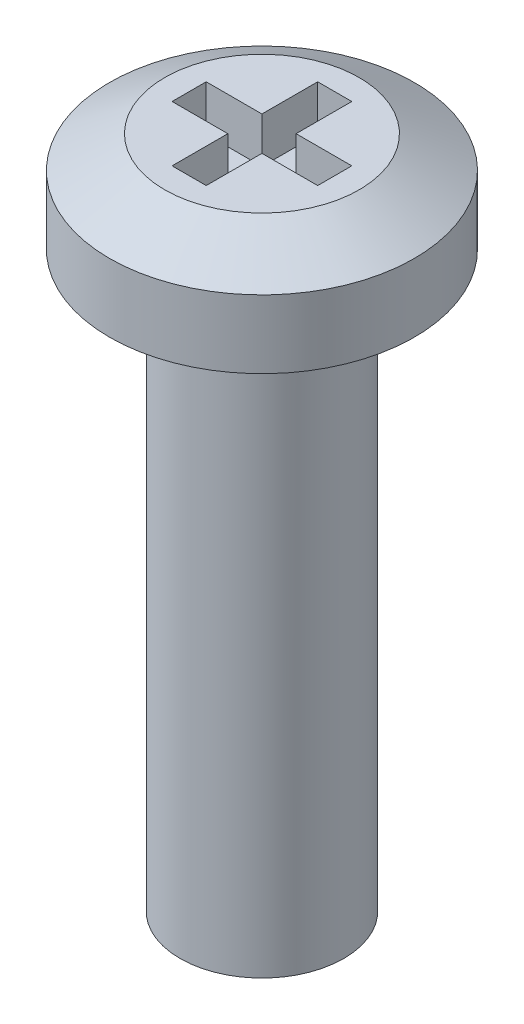
ISO-10303-21;
HEADER;
FILE_DESCRIPTION(('STEP AP214'),'2;1');
FILE_NAME('part.step','',(''),(''),'','','');
FILE_SCHEMA(('AUTOMOTIVE_DESIGN { 1 0 10303 214 1 1 1 1 }'));
ENDSEC;
DATA;
#1=APPLICATION_CONTEXT('core data for automotive mechanical design processes');
#2=APPLICATION_PROTOCOL_DEFINITION('international standard','automotive_design',2000,#1);
#3=PRODUCT_CONTEXT('',#1,'mechanical');
#4=PRODUCT('Part','Part','',(#3));
#5=PRODUCT_RELATED_PRODUCT_CATEGORY('part','',(#4));
#6=PRODUCT_DEFINITION_FORMATION('','',#4);
#7=PRODUCT_DEFINITION_CONTEXT('part definition',#1,'design');
#8=PRODUCT_DEFINITION('design','',#6,#7);
#9=PRODUCT_DEFINITION_SHAPE('','',#8);
#10=(LENGTH_UNIT() NAMED_UNIT(*) SI_UNIT(.MILLI.,.METRE.));
#11=(NAMED_UNIT(*) PLANE_ANGLE_UNIT() SI_UNIT($,.RADIAN.));
#12=(NAMED_UNIT(*) SI_UNIT($,.STERADIAN.) SOLID_ANGLE_UNIT());
#13=UNCERTAINTY_MEASURE_WITH_UNIT(LENGTH_MEASURE(1.E-05),#10,'distance_accuracy_value','');
#14=(GEOMETRIC_REPRESENTATION_CONTEXT(3) GLOBAL_UNCERTAINTY_ASSIGNED_CONTEXT((#13)) GLOBAL_UNIT_ASSIGNED_CONTEXT((#10,
#11,#12)) REPRESENTATION_CONTEXT('',''));
#15=CARTESIAN_POINT('',(0.,0.,0.));
#16=DIRECTION('',(0.,0.,1.));
#17=DIRECTION('',(1.,0.,0.));
#18=AXIS2_PLACEMENT_3D('',#15,#16,#17);
#19=CARTESIAN_POINT('',(0.,2.2,0.));
#20=DIRECTION('',(0.,1.,0.));
#21=DIRECTION('',(0.,0.,1.));
#22=AXIS2_PLACEMENT_3D('',#19,#20,#21);
#23=PLANE('',#22);
#24=CARTESIAN_POINT('',(0.,2.2,0.));
#25=DIRECTION('',(0.,1.,0.));
#26=DIRECTION('',(0.,0.,1.));
#27=AXIS2_PLACEMENT_3D('',#24,#25,#26);
#28=CIRCLE('',#27,2.13756443470178);
#29=CARTESIAN_POINT('',(0.,2.2,2.13756443470178));
#30=VERTEX_POINT('',#29);
#31=EDGE_CURVE('E193',#30,#30,#28,.T.);
#32=ORIENTED_EDGE('',*,*,#31,.T.);
#33=EDGE_LOOP('',(#32));
#34=FACE_BOUND('',#33,.T.);
#35=DIRECTION('',(0.,0.,-1.));
#36=VECTOR('',#35,1.);
#37=CARTESIAN_POINT('',(-1.6,2.2,0.));
#38=LINE('',#37,#36);
#39=CARTESIAN_POINT('',(-1.6,2.2,0.375));
#40=VERTEX_POINT('',#39);
#41=CARTESIAN_POINT('',(-1.6,2.2,-0.375));
#42=VERTEX_POINT('',#41);
#43=EDGE_CURVE('E161',#40,#42,#38,.T.);
#44=ORIENTED_EDGE('',*,*,#43,.T.);
#45=DIRECTION('',(1.,0.,0.));
#46=VECTOR('',#45,1.);
#47=CARTESIAN_POINT('',(0.,2.2,-0.375));
#48=LINE('',#47,#46);
#49=CARTESIAN_POINT('',(-0.375,2.2,-0.375));
#50=VERTEX_POINT('',#49);
#51=EDGE_CURVE('E48',#42,#50,#48,.T.);
#52=ORIENTED_EDGE('',*,*,#51,.T.);
#53=DIRECTION('',(0.,0.,-1.));
#54=VECTOR('',#53,1.);
#55=CARTESIAN_POINT('',(-0.375,2.2,0.));
#56=LINE('',#55,#54);
#57=CARTESIAN_POINT('',(-0.375,2.2,-1.6));
#58=VERTEX_POINT('',#57);
#59=EDGE_CURVE('E98',#50,#58,#56,.T.);
#60=ORIENTED_EDGE('',*,*,#59,.T.);
#61=DIRECTION('',(1.,0.,0.));
#62=VECTOR('',#61,1.);
#63=CARTESIAN_POINT('',(0.,2.2,-1.6));
#64=LINE('',#63,#62);
#65=CARTESIAN_POINT('',(0.375,2.2,-1.6));
#66=VERTEX_POINT('',#65);
#67=EDGE_CURVE('E187',#58,#66,#64,.T.);
#68=ORIENTED_EDGE('',*,*,#67,.T.);
#69=DIRECTION('',(0.,0.,-1.));
#70=VECTOR('',#69,1.);
#71=CARTESIAN_POINT('',(0.375,2.2,0.));
#72=LINE('',#71,#70);
#73=CARTESIAN_POINT('',(0.375,2.2,-0.375));
#74=VERTEX_POINT('',#73);
#75=EDGE_CURVE('E145',#74,#66,#72,.T.);
#76=ORIENTED_EDGE('',*,*,#75,.F.);
#77=DIRECTION('',(1.,0.,0.));
#78=VECTOR('',#77,1.);
#79=CARTESIAN_POINT('',(0.,2.2,-0.375));
#80=LINE('',#79,#78);
#81=CARTESIAN_POINT('',(1.6,2.2,-0.375));
#82=VERTEX_POINT('',#81);
#83=EDGE_CURVE('E183',#74,#82,#80,.T.);
#84=ORIENTED_EDGE('',*,*,#83,.T.);
#85=DIRECTION('',(0.,0.,-1.));
#86=VECTOR('',#85,1.);
#87=CARTESIAN_POINT('',(1.6,2.2,0.));
#88=LINE('',#87,#86);
#89=CARTESIAN_POINT('',(1.6,2.2,0.375));
#90=VERTEX_POINT('',#89);
#91=EDGE_CURVE('E180',#90,#82,#88,.T.);
#92=ORIENTED_EDGE('',*,*,#91,.F.);
#93=DIRECTION('',(1.,0.,0.));
#94=VECTOR('',#93,1.);
#95=CARTESIAN_POINT('',(0.,2.2,0.375));
#96=LINE('',#95,#94);
#97=CARTESIAN_POINT('',(0.375,2.2,0.375));
#98=VERTEX_POINT('',#97);
#99=EDGE_CURVE('E177',#98,#90,#96,.T.);
#100=ORIENTED_EDGE('',*,*,#99,.F.);
#101=DIRECTION('',(0.,0.,-1.));
#102=VECTOR('',#101,1.);
#103=CARTESIAN_POINT('',(0.375,2.2,0.));
#104=LINE('',#103,#102);
#105=CARTESIAN_POINT('',(0.375,2.2,1.6));
#106=VERTEX_POINT('',#105);
#107=EDGE_CURVE('E174',#106,#98,#104,.T.);
#108=ORIENTED_EDGE('',*,*,#107,.F.);
#109=DIRECTION('',(1.,0.,0.));
#110=VECTOR('',#109,1.);
#111=CARTESIAN_POINT('',(0.,2.2,1.6));
#112=LINE('',#111,#110);
#113=CARTESIAN_POINT('',(-0.375,2.2,1.6));
#114=VERTEX_POINT('',#113);
#115=EDGE_CURVE('E171',#114,#106,#112,.T.);
#116=ORIENTED_EDGE('',*,*,#115,.F.);
#117=DIRECTION('',(0.,0.,-1.));
#118=VECTOR('',#117,1.);
#119=CARTESIAN_POINT('',(-0.375,2.2,0.));
#120=LINE('',#119,#118);
#121=CARTESIAN_POINT('',(-0.375,2.2,0.375));
#122=VERTEX_POINT('',#121);
#123=EDGE_CURVE('E168',#114,#122,#120,.T.);
#124=ORIENTED_EDGE('',*,*,#123,.T.);
#125=DIRECTION('',(1.,0.,0.));
#126=VECTOR('',#125,1.);
#127=CARTESIAN_POINT('',(0.,2.2,0.375));
#128=LINE('',#127,#126);
#129=EDGE_CURVE('E165',#40,#122,#128,.T.);
#130=ORIENTED_EDGE('',*,*,#129,.F.);
#131=EDGE_LOOP('',(#44,#52,#60,#68,#76,#84,#92,#100,#108,#116,#124,#130));
#132=FACE_BOUND('',#131,.T.);
#133=ADVANCED_FACE('F33',(#34,#132),#23,.T.);
#134=CARTESIAN_POINT('',(0.,1.5,0.));
#135=DIRECTION('',(0.,-1.,0.));
#136=DIRECTION('',(0.,0.,-1.));
#137=AXIS2_PLACEMENT_3D('',#134,#135,#136);
#138=CYLINDRICAL_SURFACE('',#137,3.35);
#139=CARTESIAN_POINT('',(0.,1.5,0.));
#140=DIRECTION('',(0.,1.,0.));
#141=DIRECTION('',(0.,0.,1.));
#142=AXIS2_PLACEMENT_3D('',#139,#140,#141);
#143=CIRCLE('',#142,3.35);
#144=CARTESIAN_POINT('',(0.,1.5,3.35));
#145=VERTEX_POINT('',#144);
#146=EDGE_CURVE('E41',#145,#145,#143,.T.);
#147=ORIENTED_EDGE('',*,*,#146,.F.);
#148=EDGE_LOOP('',(#147));
#149=FACE_BOUND('',#148,.T.);
#150=CARTESIAN_POINT('',(0.,0.,0.));
#151=DIRECTION('',(0.,1.,0.));
#152=DIRECTION('',(0.,0.,1.));
#153=AXIS2_PLACEMENT_3D('',#150,#151,#152);
#154=CIRCLE('',#153,3.35);
#155=CARTESIAN_POINT('',(0.,0.,3.35));
#156=VERTEX_POINT('',#155);
#157=EDGE_CURVE('E213',#156,#156,#154,.T.);
#158=ORIENTED_EDGE('',*,*,#157,.T.);
#159=EDGE_LOOP('',(#158));
#160=FACE_BOUND('',#159,.T.);
#161=ADVANCED_FACE('F35',(#149,#160),#138,.T.);
#162=CARTESIAN_POINT('',(0.,0.,0.));
#163=DIRECTION('',(0.,1.,0.));
#164=DIRECTION('',(0.,0.,1.));
#165=AXIS2_PLACEMENT_3D('',#162,#163,#164);
#166=PLANE('',#165);
#167=CARTESIAN_POINT('',(0.,0.,0.));
#168=DIRECTION('',(0.,1.,0.));
#169=DIRECTION('',(0.,0.,1.));
#170=AXIS2_PLACEMENT_3D('',#167,#168,#169);
#171=CIRCLE('',#170,1.8);
#172=CARTESIAN_POINT('',(0.,0.,1.8));
#173=VERTEX_POINT('',#172);
#174=EDGE_CURVE('E11',#173,#173,#171,.F.);
#175=ORIENTED_EDGE('',*,*,#174,.F.);
#176=EDGE_LOOP('',(#175));
#177=FACE_BOUND('',#176,.T.);
#178=ORIENTED_EDGE('',*,*,#157,.F.);
#179=EDGE_LOOP('',(#178));
#180=FACE_BOUND('',#179,.T.);
#181=ADVANCED_FACE('F219',(#177,#180),#166,.F.);
#182=CARTESIAN_POINT('',(0.,1.5,0.));
#183=DIRECTION('',(0.,-1.,0.));
#184=DIRECTION('',(0.,0.,1.));
#185=AXIS2_PLACEMENT_3D('',#182,#183,#184);
#186=CONICAL_SURFACE('',#185,3.35,1.0471975511966);
#187=ORIENTED_EDGE('',*,*,#31,.F.);
#188=EDGE_LOOP('',(#187));
#189=FACE_BOUND('',#188,.T.);
#190=ORIENTED_EDGE('',*,*,#146,.T.);
#191=EDGE_LOOP('',(#190));
#192=FACE_BOUND('',#191,.T.);
#193=ADVANCED_FACE('F221',(#189,#192),#186,.T.);
#194=CARTESIAN_POINT('',(0.,1.2,-0.375));
#195=DIRECTION('',(0.,0.,1.));
#196=DIRECTION('',(1.,0.,0.));
#197=AXIS2_PLACEMENT_3D('',#194,#195,#196);
#198=PLANE('',#197);
#199=ORIENTED_EDGE('',*,*,#51,.F.);
#200=DIRECTION('',(0.,1.,0.));
#201=VECTOR('',#200,1.);
#202=CARTESIAN_POINT('',(-1.6,1.2,-0.375));
#203=LINE('',#202,#201);
#204=CARTESIAN_POINT('',(-1.6,1.2,-0.375));
#205=VERTEX_POINT('',#204);
#206=EDGE_CURVE('E159',#205,#42,#203,.T.);
#207=ORIENTED_EDGE('',*,*,#206,.F.);
#208=DIRECTION('',(1.,0.,0.));
#209=VECTOR('',#208,1.);
#210=CARTESIAN_POINT('',(0.,1.2,-0.375));
#211=LINE('',#210,#209);
#212=CARTESIAN_POINT('',(-0.375,1.2,-0.375));
#213=VERTEX_POINT('',#212);
#214=EDGE_CURVE('E190',#205,#213,#211,.T.);
#215=ORIENTED_EDGE('',*,*,#214,.T.);
#216=DIRECTION('',(0.,1.,0.));
#217=VECTOR('',#216,1.);
#218=CARTESIAN_POINT('',(-0.375,1.2,-0.375));
#219=LINE('',#218,#217);
#220=EDGE_CURVE('E191',#213,#50,#219,.T.);
#221=ORIENTED_EDGE('',*,*,#220,.T.);
#222=EDGE_LOOP('',(#199,#207,#215,#221));
#223=FACE_BOUND('',#222,.T.);
#224=ADVANCED_FACE('F227',(#223),#198,.T.);
#225=CARTESIAN_POINT('',(-0.375,1.2,0.));
#226=DIRECTION('',(1.,0.,0.));
#227=DIRECTION('',(0.,0.,-1.));
#228=AXIS2_PLACEMENT_3D('',#225,#226,#227);
#229=PLANE('',#228);
#230=ORIENTED_EDGE('',*,*,#59,.F.);
#231=ORIENTED_EDGE('',*,*,#220,.F.);
#232=DIRECTION('',(0.,0.,-1.));
#233=VECTOR('',#232,1.);
#234=CARTESIAN_POINT('',(-0.375,1.2,0.));
#235=LINE('',#234,#233);
#236=CARTESIAN_POINT('',(-0.375,1.2,-1.6));
#237=VERTEX_POINT('',#236);
#238=EDGE_CURVE('E57',#213,#237,#235,.T.);
#239=ORIENTED_EDGE('',*,*,#238,.T.);
#240=DIRECTION('',(0.,1.,0.));
#241=VECTOR('',#240,1.);
#242=CARTESIAN_POINT('',(-0.375,1.2,-1.6));
#243=LINE('',#242,#241);
#244=EDGE_CURVE('E137',#237,#58,#243,.T.);
#245=ORIENTED_EDGE('',*,*,#244,.T.);
#246=EDGE_LOOP('',(#230,#231,#239,#245));
#247=FACE_BOUND('',#246,.T.);
#248=ADVANCED_FACE('F241',(#247),#229,.T.);
#249=CARTESIAN_POINT('',(0.,1.2,-1.6));
#250=DIRECTION('',(0.,0.,1.));
#251=DIRECTION('',(1.,0.,0.));
#252=AXIS2_PLACEMENT_3D('',#249,#250,#251);
#253=PLANE('',#252);
#254=ORIENTED_EDGE('',*,*,#67,.F.);
#255=ORIENTED_EDGE('',*,*,#244,.F.);
#256=DIRECTION('',(1.,0.,0.));
#257=VECTOR('',#256,1.);
#258=CARTESIAN_POINT('',(0.,1.2,-1.6));
#259=LINE('',#258,#257);
#260=CARTESIAN_POINT('',(0.375,1.2,-1.6));
#261=VERTEX_POINT('',#260);
#262=EDGE_CURVE('E131',#237,#261,#259,.T.);
#263=ORIENTED_EDGE('',*,*,#262,.T.);
#264=DIRECTION('',(0.,1.,0.));
#265=VECTOR('',#264,1.);
#266=CARTESIAN_POINT('',(0.375,1.2,-1.6));
#267=LINE('',#266,#265);
#268=EDGE_CURVE('E135',#261,#66,#267,.T.);
#269=ORIENTED_EDGE('',*,*,#268,.T.);
#270=EDGE_LOOP('',(#254,#255,#263,#269));
#271=FACE_BOUND('',#270,.T.);
#272=ADVANCED_FACE('F134',(#271),#253,.T.);
#273=CARTESIAN_POINT('',(0.375,1.2,0.));
#274=DIRECTION('',(1.,0.,0.));
#275=DIRECTION('',(0.,0.,-1.));
#276=AXIS2_PLACEMENT_3D('',#273,#274,#275);
#277=PLANE('',#276);
#278=ORIENTED_EDGE('',*,*,#75,.T.);
#279=ORIENTED_EDGE('',*,*,#268,.F.);
#280=DIRECTION('',(0.,0.,-1.));
#281=VECTOR('',#280,1.);
#282=CARTESIAN_POINT('',(0.375,1.2,0.));
#283=LINE('',#282,#281);
#284=CARTESIAN_POINT('',(0.375,1.2,-0.375));
#285=VERTEX_POINT('',#284);
#286=EDGE_CURVE('E139',#285,#261,#283,.T.);
#287=ORIENTED_EDGE('',*,*,#286,.F.);
#288=DIRECTION('',(0.,1.,0.));
#289=VECTOR('',#288,1.);
#290=CARTESIAN_POINT('',(0.375,1.2,-0.375));
#291=LINE('',#290,#289);
#292=EDGE_CURVE('E147',#285,#74,#291,.T.);
#293=ORIENTED_EDGE('',*,*,#292,.T.);
#294=EDGE_LOOP('',(#278,#279,#287,#293));
#295=FACE_BOUND('',#294,.T.);
#296=ADVANCED_FACE('F143',(#295),#277,.F.);
#297=CARTESIAN_POINT('',(0.,1.2,-0.375));
#298=DIRECTION('',(0.,0.,1.));
#299=DIRECTION('',(1.,0.,0.));
#300=AXIS2_PLACEMENT_3D('',#297,#298,#299);
#301=PLANE('',#300);
#302=ORIENTED_EDGE('',*,*,#83,.F.);
#303=ORIENTED_EDGE('',*,*,#292,.F.);
#304=DIRECTION('',(1.,0.,0.));
#305=VECTOR('',#304,1.);
#306=CARTESIAN_POINT('',(0.,1.2,-0.375));
#307=LINE('',#306,#305);
#308=CARTESIAN_POINT('',(1.6,1.2,-0.375));
#309=VERTEX_POINT('',#308);
#310=EDGE_CURVE('E152',#285,#309,#307,.T.);
#311=ORIENTED_EDGE('',*,*,#310,.T.);
#312=DIRECTION('',(0.,1.,0.));
#313=VECTOR('',#312,1.);
#314=CARTESIAN_POINT('',(1.6,1.2,-0.375));
#315=LINE('',#314,#313);
#316=EDGE_CURVE('E196',#309,#82,#315,.T.);
#317=ORIENTED_EDGE('',*,*,#316,.T.);
#318=EDGE_LOOP('',(#302,#303,#311,#317));
#319=FACE_BOUND('',#318,.T.);
#320=ADVANCED_FACE('F268',(#319),#301,.T.);
#321=CARTESIAN_POINT('',(1.6,1.2,0.));
#322=DIRECTION('',(1.,0.,0.));
#323=DIRECTION('',(0.,0.,-1.));
#324=AXIS2_PLACEMENT_3D('',#321,#322,#323);
#325=PLANE('',#324);
#326=ORIENTED_EDGE('',*,*,#91,.T.);
#327=ORIENTED_EDGE('',*,*,#316,.F.);
#328=DIRECTION('',(0.,0.,-1.));
#329=VECTOR('',#328,1.);
#330=CARTESIAN_POINT('',(1.6,1.2,0.));
#331=LINE('',#330,#329);
#332=CARTESIAN_POINT('',(1.6,1.2,0.375));
#333=VERTEX_POINT('',#332);
#334=EDGE_CURVE('E154',#333,#309,#331,.T.);
#335=ORIENTED_EDGE('',*,*,#334,.F.);
#336=DIRECTION('',(0.,1.,0.));
#337=VECTOR('',#336,1.);
#338=CARTESIAN_POINT('',(1.6,1.2,0.375));
#339=LINE('',#338,#337);
#340=EDGE_CURVE('E198',#333,#90,#339,.T.);
#341=ORIENTED_EDGE('',*,*,#340,.T.);
#342=EDGE_LOOP('',(#326,#327,#335,#341));
#343=FACE_BOUND('',#342,.T.);
#344=ADVANCED_FACE('F264',(#343),#325,.F.);
#345=CARTESIAN_POINT('',(0.,1.2,0.375));
#346=DIRECTION('',(0.,0.,1.));
#347=DIRECTION('',(1.,0.,0.));
#348=AXIS2_PLACEMENT_3D('',#345,#346,#347);
#349=PLANE('',#348);
#350=ORIENTED_EDGE('',*,*,#99,.T.);
#351=ORIENTED_EDGE('',*,*,#340,.F.);
#352=DIRECTION('',(1.,0.,0.));
#353=VECTOR('',#352,1.);
#354=CARTESIAN_POINT('',(0.,1.2,0.375));
#355=LINE('',#354,#353);
#356=CARTESIAN_POINT('',(0.375,1.2,0.375));
#357=VERTEX_POINT('',#356);
#358=EDGE_CURVE('E307',#357,#333,#355,.T.);
#359=ORIENTED_EDGE('',*,*,#358,.F.);
#360=DIRECTION('',(0.,1.,0.));
#361=VECTOR('',#360,1.);
#362=CARTESIAN_POINT('',(0.375,1.2,0.375));
#363=LINE('',#362,#361);
#364=EDGE_CURVE('E200',#357,#98,#363,.T.);
#365=ORIENTED_EDGE('',*,*,#364,.T.);
#366=EDGE_LOOP('',(#350,#351,#359,#365));
#367=FACE_BOUND('',#366,.T.);
#368=ADVANCED_FACE('F260',(#367),#349,.F.);
#369=CARTESIAN_POINT('',(0.375,1.2,0.));
#370=DIRECTION('',(1.,0.,0.));
#371=DIRECTION('',(0.,0.,-1.));
#372=AXIS2_PLACEMENT_3D('',#369,#370,#371);
#373=PLANE('',#372);
#374=ORIENTED_EDGE('',*,*,#107,.T.);
#375=ORIENTED_EDGE('',*,*,#364,.F.);
#376=DIRECTION('',(0.,0.,-1.));
#377=VECTOR('',#376,1.);
#378=CARTESIAN_POINT('',(0.375,1.2,0.));
#379=LINE('',#378,#377);
#380=CARTESIAN_POINT('',(0.375,1.2,1.6));
#381=VERTEX_POINT('',#380);
#382=EDGE_CURVE('E304',#381,#357,#379,.T.);
#383=ORIENTED_EDGE('',*,*,#382,.F.);
#384=DIRECTION('',(0.,1.,0.));
#385=VECTOR('',#384,1.);
#386=CARTESIAN_POINT('',(0.375,1.2,1.6));
#387=LINE('',#386,#385);
#388=EDGE_CURVE('E202',#381,#106,#387,.T.);
#389=ORIENTED_EDGE('',*,*,#388,.T.);
#390=EDGE_LOOP('',(#374,#375,#383,#389));
#391=FACE_BOUND('',#390,.T.);
#392=ADVANCED_FACE('F256',(#391),#373,.F.);
#393=CARTESIAN_POINT('',(0.,1.2,1.6));
#394=DIRECTION('',(0.,0.,1.));
#395=DIRECTION('',(1.,0.,0.));
#396=AXIS2_PLACEMENT_3D('',#393,#394,#395);
#397=PLANE('',#396);
#398=ORIENTED_EDGE('',*,*,#115,.T.);
#399=ORIENTED_EDGE('',*,*,#388,.F.);
#400=DIRECTION('',(1.,0.,0.));
#401=VECTOR('',#400,1.);
#402=CARTESIAN_POINT('',(0.,1.2,1.6));
#403=LINE('',#402,#401);
#404=CARTESIAN_POINT('',(-0.375,1.2,1.6));
#405=VERTEX_POINT('',#404);
#406=EDGE_CURVE('E301',#405,#381,#403,.T.);
#407=ORIENTED_EDGE('',*,*,#406,.F.);
#408=DIRECTION('',(0.,1.,0.));
#409=VECTOR('',#408,1.);
#410=CARTESIAN_POINT('',(-0.375,1.2,1.6));
#411=LINE('',#410,#409);
#412=EDGE_CURVE('E204',#405,#114,#411,.T.);
#413=ORIENTED_EDGE('',*,*,#412,.T.);
#414=EDGE_LOOP('',(#398,#399,#407,#413));
#415=FACE_BOUND('',#414,.T.);
#416=ADVANCED_FACE('F252',(#415),#397,.F.);
#417=CARTESIAN_POINT('',(-0.375,1.2,0.));
#418=DIRECTION('',(1.,0.,0.));
#419=DIRECTION('',(0.,0.,-1.));
#420=AXIS2_PLACEMENT_3D('',#417,#418,#419);
#421=PLANE('',#420);
#422=ORIENTED_EDGE('',*,*,#123,.F.);
#423=ORIENTED_EDGE('',*,*,#412,.F.);
#424=DIRECTION('',(0.,0.,-1.));
#425=VECTOR('',#424,1.);
#426=CARTESIAN_POINT('',(-0.375,1.2,0.));
#427=LINE('',#426,#425);
#428=CARTESIAN_POINT('',(-0.375,1.2,0.375));
#429=VERTEX_POINT('',#428);
#430=EDGE_CURVE('E299',#405,#429,#427,.T.);
#431=ORIENTED_EDGE('',*,*,#430,.T.);
#432=DIRECTION('',(0.,1.,0.));
#433=VECTOR('',#432,1.);
#434=CARTESIAN_POINT('',(-0.375,1.2,0.375));
#435=LINE('',#434,#433);
#436=EDGE_CURVE('E206',#429,#122,#435,.T.);
#437=ORIENTED_EDGE('',*,*,#436,.T.);
#438=EDGE_LOOP('',(#422,#423,#431,#437));
#439=FACE_BOUND('',#438,.T.);
#440=ADVANCED_FACE('F248',(#439),#421,.T.);
#441=CARTESIAN_POINT('',(0.,1.2,0.375));
#442=DIRECTION('',(0.,0.,1.));
#443=DIRECTION('',(1.,0.,0.));
#444=AXIS2_PLACEMENT_3D('',#441,#442,#443);
#445=PLANE('',#444);
#446=ORIENTED_EDGE('',*,*,#129,.T.);
#447=ORIENTED_EDGE('',*,*,#436,.F.);
#448=DIRECTION('',(1.,0.,0.));
#449=VECTOR('',#448,1.);
#450=CARTESIAN_POINT('',(0.,1.2,0.375));
#451=LINE('',#450,#449);
#452=CARTESIAN_POINT('',(-1.6,1.2,0.375));
#453=VERTEX_POINT('',#452);
#454=EDGE_CURVE('E296',#453,#429,#451,.T.);
#455=ORIENTED_EDGE('',*,*,#454,.F.);
#456=DIRECTION('',(0.,1.,0.));
#457=VECTOR('',#456,1.);
#458=CARTESIAN_POINT('',(-1.6,1.2,0.375));
#459=LINE('',#458,#457);
#460=EDGE_CURVE('E208',#453,#40,#459,.T.);
#461=ORIENTED_EDGE('',*,*,#460,.T.);
#462=EDGE_LOOP('',(#446,#447,#455,#461));
#463=FACE_BOUND('',#462,.T.);
#464=ADVANCED_FACE('F245',(#463),#445,.F.);
#465=CARTESIAN_POINT('',(-1.6,1.2,0.));
#466=DIRECTION('',(1.,0.,0.));
#467=DIRECTION('',(0.,0.,-1.));
#468=AXIS2_PLACEMENT_3D('',#465,#466,#467);
#469=PLANE('',#468);
#470=ORIENTED_EDGE('',*,*,#43,.F.);
#471=ORIENTED_EDGE('',*,*,#460,.F.);
#472=DIRECTION('',(0.,0.,-1.));
#473=VECTOR('',#472,1.);
#474=CARTESIAN_POINT('',(-1.6,1.2,0.));
#475=LINE('',#474,#473);
#476=EDGE_CURVE('E105',#453,#205,#475,.T.);
#477=ORIENTED_EDGE('',*,*,#476,.T.);
#478=ORIENTED_EDGE('',*,*,#206,.T.);
#479=EDGE_LOOP('',(#470,#471,#477,#478));
#480=FACE_BOUND('',#479,.T.);
#481=ADVANCED_FACE('F242',(#480),#469,.T.);
#482=CARTESIAN_POINT('',(0.,1.2,0.));
#483=DIRECTION('',(0.,1.,0.));
#484=DIRECTION('',(0.,0.,1.));
#485=AXIS2_PLACEMENT_3D('',#482,#483,#484);
#486=PLANE('',#485);
#487=ORIENTED_EDGE('',*,*,#214,.F.);
#488=ORIENTED_EDGE('',*,*,#476,.F.);
#489=ORIENTED_EDGE('',*,*,#454,.T.);
#490=ORIENTED_EDGE('',*,*,#430,.F.);
#491=ORIENTED_EDGE('',*,*,#406,.T.);
#492=ORIENTED_EDGE('',*,*,#382,.T.);
#493=ORIENTED_EDGE('',*,*,#358,.T.);
#494=ORIENTED_EDGE('',*,*,#334,.T.);
#495=ORIENTED_EDGE('',*,*,#310,.F.);
#496=ORIENTED_EDGE('',*,*,#286,.T.);
#497=ORIENTED_EDGE('',*,*,#262,.F.);
#498=ORIENTED_EDGE('',*,*,#238,.F.);
#499=EDGE_LOOP('',(#487,#488,#489,#490,#491,#492,#493,#494,#495,#496,#497,#498));
#500=FACE_BOUND('',#499,.T.);
#501=ADVANCED_FACE('F150',(#500),#486,.T.);
#502=CARTESIAN_POINT('',(0.,-12.6,0.));
#503=DIRECTION('',(0.,1.,0.));
#504=DIRECTION('',(0.,0.,1.));
#505=AXIS2_PLACEMENT_3D('',#502,#503,#504);
#506=CYLINDRICAL_SURFACE('',#505,1.8);
#507=CARTESIAN_POINT('',(0.,-12.6,0.));
#508=DIRECTION('',(0.,-1.,0.));
#509=DIRECTION('',(0.,0.,-1.));
#510=AXIS2_PLACEMENT_3D('',#507,#508,#509);
#511=CIRCLE('',#510,1.8);
#512=CARTESIAN_POINT('',(0.,-12.6,-1.8));
#513=VERTEX_POINT('',#512);
#514=EDGE_CURVE('E162',#513,#513,#511,.T.);
#515=ORIENTED_EDGE('',*,*,#514,.F.);
#516=EDGE_LOOP('',(#515));
#517=FACE_BOUND('',#516,.T.);
#518=ORIENTED_EDGE('',*,*,#174,.T.);
#519=EDGE_LOOP('',(#518));
#520=FACE_BOUND('',#519,.T.);
#521=ADVANCED_FACE('F281',(#517,#520),#506,.T.);
#522=CARTESIAN_POINT('',(0.,-12.6,0.));
#523=DIRECTION('',(0.,-1.,0.));
#524=DIRECTION('',(0.,0.,-1.));
#525=AXIS2_PLACEMENT_3D('',#522,#523,#524);
#526=PLANE('',#525);
#527=ORIENTED_EDGE('',*,*,#514,.T.);
#528=EDGE_LOOP('',(#527));
#529=FACE_BOUND('',#528,.T.);
#530=ADVANCED_FACE('F284',(#529),#526,.T.);
#531=CLOSED_SHELL('',(#133,#161,#181,#193,#224,#248,#272,#296,#320,#344,#368,#392,#416,#440,
#464,#481,#501,#521,#530));
#532=MANIFOLD_SOLID_BREP('B2',#531);
#533=ADVANCED_BREP_SHAPE_REPRESENTATION('',(#18,#532),#14);
#534=SHAPE_DEFINITION_REPRESENTATION(#9,#533);
ENDSEC;
END-ISO-10303-21;
